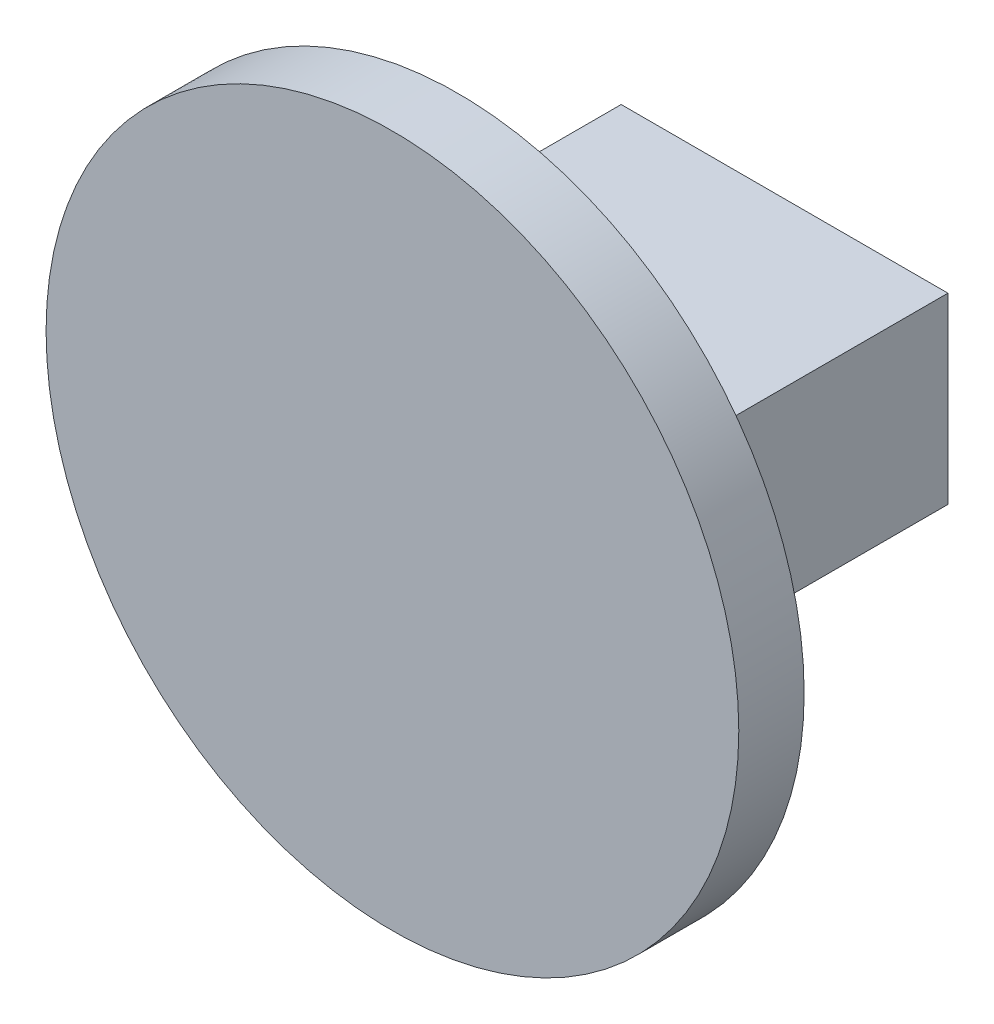
ISO-10303-21;
HEADER;
FILE_DESCRIPTION(('STEP AP214'),'2;1');
FILE_NAME('part.step','',(''),(''),'','','');
FILE_SCHEMA(('AUTOMOTIVE_DESIGN { 1 0 10303 214 1 1 1 1 }'));
ENDSEC;
DATA;
#1=APPLICATION_CONTEXT('core data for automotive mechanical design processes');
#2=APPLICATION_PROTOCOL_DEFINITION('international standard','automotive_design',2000,#1);
#3=PRODUCT_CONTEXT('',#1,'mechanical');
#4=PRODUCT('Part','Part','',(#3));
#5=PRODUCT_RELATED_PRODUCT_CATEGORY('part','',(#4));
#6=PRODUCT_DEFINITION_FORMATION('','',#4);
#7=PRODUCT_DEFINITION_CONTEXT('part definition',#1,'design');
#8=PRODUCT_DEFINITION('design','',#6,#7);
#9=PRODUCT_DEFINITION_SHAPE('','',#8);
#10=(LENGTH_UNIT() NAMED_UNIT(*) SI_UNIT(.MILLI.,.METRE.));
#11=(NAMED_UNIT(*) PLANE_ANGLE_UNIT() SI_UNIT($,.RADIAN.));
#12=(NAMED_UNIT(*) SI_UNIT($,.STERADIAN.) SOLID_ANGLE_UNIT());
#13=UNCERTAINTY_MEASURE_WITH_UNIT(LENGTH_MEASURE(1.E-05),#10,'distance_accuracy_value','');
#14=(GEOMETRIC_REPRESENTATION_CONTEXT(3) GLOBAL_UNCERTAINTY_ASSIGNED_CONTEXT((#13)) GLOBAL_UNIT_ASSIGNED_CONTEXT((#10,
#11,#12)) REPRESENTATION_CONTEXT('',''));
#15=CARTESIAN_POINT('',(0.,0.,0.));
#16=DIRECTION('',(0.,0.,1.));
#17=DIRECTION('',(1.,0.,0.));
#18=AXIS2_PLACEMENT_3D('',#15,#16,#17);
#19=CARTESIAN_POINT('',(0.,0.,254.));
#20=DIRECTION('',(0.,0.,-1.));
#21=DIRECTION('',(-1.,0.,0.));
#22=AXIS2_PLACEMENT_3D('',#19,#20,#21);
#23=CYLINDRICAL_SURFACE('',#22,1346.2);
#24=CARTESIAN_POINT('',(0.,0.,254.));
#25=DIRECTION('',(0.,0.,1.));
#26=DIRECTION('',(1.,0.,0.));
#27=AXIS2_PLACEMENT_3D('',#24,#25,#26);
#28=CIRCLE('',#27,1346.2);
#29=CARTESIAN_POINT('',(1346.2,0.,254.));
#30=VERTEX_POINT('',#29);
#31=EDGE_CURVE('E12',#30,#30,#28,.T.);
#32=ORIENTED_EDGE('',*,*,#31,.F.);
#33=EDGE_LOOP('',(#32));
#34=FACE_BOUND('',#33,.T.);
#35=CARTESIAN_POINT('',(0.,0.,0.));
#36=DIRECTION('',(0.,0.,1.));
#37=DIRECTION('',(1.,0.,0.));
#38=AXIS2_PLACEMENT_3D('',#35,#36,#37);
#39=CIRCLE('',#38,1346.2);
#40=CARTESIAN_POINT('',(1346.2,0.,0.));
#41=VERTEX_POINT('',#40);
#42=EDGE_CURVE('E64',#41,#41,#39,.T.);
#43=ORIENTED_EDGE('',*,*,#42,.T.);
#44=EDGE_LOOP('',(#43));
#45=FACE_BOUND('',#44,.T.);
#46=ADVANCED_FACE('F61',(#34,#45),#23,.T.);
#47=CARTESIAN_POINT('',(0.,0.,254.));
#48=DIRECTION('',(0.,0.,1.));
#49=DIRECTION('',(1.,0.,0.));
#50=AXIS2_PLACEMENT_3D('',#47,#48,#49);
#51=PLANE('',#50);
#52=ORIENTED_EDGE('',*,*,#31,.T.);
#53=EDGE_LOOP('',(#52));
#54=FACE_BOUND('',#53,.T.);
#55=ADVANCED_FACE('F150',(#54),#51,.T.);
#56=CARTESIAN_POINT('',(0.,0.,0.));
#57=DIRECTION('',(0.,0.,1.));
#58=DIRECTION('',(1.,0.,0.));
#59=AXIS2_PLACEMENT_3D('',#56,#57,#58);
#60=PLANE('',#59);
#61=DIRECTION('',(0.,1.,0.));
#62=VECTOR('',#61,1.);
#63=CARTESIAN_POINT('',(-635.,0.,0.));
#64=LINE('',#63,#62);
#65=CARTESIAN_POINT('',(-635.,-355.6,0.));
#66=VERTEX_POINT('',#65);
#67=CARTESIAN_POINT('',(-635.,355.6,0.));
#68=VERTEX_POINT('',#67);
#69=EDGE_CURVE('E120',#66,#68,#64,.T.);
#70=ORIENTED_EDGE('',*,*,#69,.F.);
#71=DIRECTION('',(1.,0.,0.));
#72=VECTOR('',#71,1.);
#73=CARTESIAN_POINT('',(0.,-355.6,0.));
#74=LINE('',#73,#72);
#75=CARTESIAN_POINT('',(635.,-355.6,0.));
#76=VERTEX_POINT('',#75);
#77=EDGE_CURVE('E75',#66,#76,#74,.T.);
#78=ORIENTED_EDGE('',*,*,#77,.T.);
#79=DIRECTION('',(0.,1.,0.));
#80=VECTOR('',#79,1.);
#81=CARTESIAN_POINT('',(635.,0.,0.));
#82=LINE('',#81,#80);
#83=CARTESIAN_POINT('',(635.,355.6,0.));
#84=VERTEX_POINT('',#83);
#85=EDGE_CURVE('E80',#76,#84,#82,.T.);
#86=ORIENTED_EDGE('',*,*,#85,.T.);
#87=DIRECTION('',(1.,0.,0.));
#88=VECTOR('',#87,1.);
#89=CARTESIAN_POINT('',(0.,355.6,0.));
#90=LINE('',#89,#88);
#91=EDGE_CURVE('E123',#68,#84,#90,.T.);
#92=ORIENTED_EDGE('',*,*,#91,.F.);
#93=EDGE_LOOP('',(#70,#78,#86,#92));
#94=FACE_BOUND('',#93,.T.);
#95=ORIENTED_EDGE('',*,*,#42,.F.);
#96=EDGE_LOOP('',(#95));
#97=FACE_BOUND('',#96,.T.);
#98=ADVANCED_FACE('F139',(#94,#97),#60,.F.);
#99=CARTESIAN_POINT('',(-635.,0.,-1270.));
#100=DIRECTION('',(1.,0.,0.));
#101=DIRECTION('',(0.,0.,-1.));
#102=AXIS2_PLACEMENT_3D('',#99,#100,#101);
#103=PLANE('',#102);
#104=ORIENTED_EDGE('',*,*,#69,.T.);
#105=DIRECTION('',(0.,0.,1.));
#106=VECTOR('',#105,1.);
#107=CARTESIAN_POINT('',(-635.,355.6,-1270.));
#108=LINE('',#107,#106);
#109=CARTESIAN_POINT('',(-635.,355.6,-1270.));
#110=VERTEX_POINT('',#109);
#111=EDGE_CURVE('E133',#110,#68,#108,.T.);
#112=ORIENTED_EDGE('',*,*,#111,.F.);
#113=DIRECTION('',(0.,1.,0.));
#114=VECTOR('',#113,1.);
#115=CARTESIAN_POINT('',(-635.,0.,-1270.));
#116=LINE('',#115,#114);
#117=CARTESIAN_POINT('',(-635.,-355.6,-1270.));
#118=VERTEX_POINT('',#117);
#119=EDGE_CURVE('E106',#118,#110,#116,.T.);
#120=ORIENTED_EDGE('',*,*,#119,.F.);
#121=DIRECTION('',(0.,0.,1.));
#122=VECTOR('',#121,1.);
#123=CARTESIAN_POINT('',(-635.,-355.6,-1270.));
#124=LINE('',#123,#122);
#125=EDGE_CURVE('E118',#118,#66,#124,.T.);
#126=ORIENTED_EDGE('',*,*,#125,.T.);
#127=EDGE_LOOP('',(#104,#112,#120,#126));
#128=FACE_BOUND('',#127,.T.);
#129=ADVANCED_FACE('F142',(#128),#103,.F.);
#130=CARTESIAN_POINT('',(0.,-355.6,-1270.));
#131=DIRECTION('',(0.,-1.,0.));
#132=DIRECTION('',(0.,0.,-1.));
#133=AXIS2_PLACEMENT_3D('',#130,#131,#132);
#134=PLANE('',#133);
#135=ORIENTED_EDGE('',*,*,#77,.F.);
#136=ORIENTED_EDGE('',*,*,#125,.F.);
#137=DIRECTION('',(1.,0.,0.));
#138=VECTOR('',#137,1.);
#139=CARTESIAN_POINT('',(0.,-355.6,-1270.));
#140=LINE('',#139,#138);
#141=CARTESIAN_POINT('',(635.,-355.6,-1270.));
#142=VERTEX_POINT('',#141);
#143=EDGE_CURVE('E111',#118,#142,#140,.T.);
#144=ORIENTED_EDGE('',*,*,#143,.T.);
#145=DIRECTION('',(0.,0.,1.));
#146=VECTOR('',#145,1.);
#147=CARTESIAN_POINT('',(635.,-355.6,-1270.));
#148=LINE('',#147,#146);
#149=EDGE_CURVE('E99',#142,#76,#148,.T.);
#150=ORIENTED_EDGE('',*,*,#149,.T.);
#151=EDGE_LOOP('',(#135,#136,#144,#150));
#152=FACE_BOUND('',#151,.T.);
#153=ADVANCED_FACE('F116',(#152),#134,.T.);
#154=CARTESIAN_POINT('',(635.,0.,-1270.));
#155=DIRECTION('',(1.,0.,0.));
#156=DIRECTION('',(0.,0.,-1.));
#157=AXIS2_PLACEMENT_3D('',#154,#155,#156);
#158=PLANE('',#157);
#159=ORIENTED_EDGE('',*,*,#85,.F.);
#160=ORIENTED_EDGE('',*,*,#149,.F.);
#161=DIRECTION('',(0.,1.,0.));
#162=VECTOR('',#161,1.);
#163=CARTESIAN_POINT('',(635.,0.,-1270.));
#164=LINE('',#163,#162);
#165=CARTESIAN_POINT('',(635.,355.6,-1270.));
#166=VERTEX_POINT('',#165);
#167=EDGE_CURVE('E102',#142,#166,#164,.T.);
#168=ORIENTED_EDGE('',*,*,#167,.T.);
#169=DIRECTION('',(0.,0.,1.));
#170=VECTOR('',#169,1.);
#171=CARTESIAN_POINT('',(635.,355.6,-1270.));
#172=LINE('',#171,#170);
#173=EDGE_CURVE('E105',#166,#84,#172,.T.);
#174=ORIENTED_EDGE('',*,*,#173,.T.);
#175=EDGE_LOOP('',(#159,#160,#168,#174));
#176=FACE_BOUND('',#175,.T.);
#177=ADVANCED_FACE('F101',(#176),#158,.T.);
#178=CARTESIAN_POINT('',(0.,355.6,-1270.));
#179=DIRECTION('',(0.,-1.,0.));
#180=DIRECTION('',(0.,0.,-1.));
#181=AXIS2_PLACEMENT_3D('',#178,#179,#180);
#182=PLANE('',#181);
#183=ORIENTED_EDGE('',*,*,#91,.T.);
#184=ORIENTED_EDGE('',*,*,#173,.F.);
#185=DIRECTION('',(1.,0.,0.));
#186=VECTOR('',#185,1.);
#187=CARTESIAN_POINT('',(0.,355.6,-1270.));
#188=LINE('',#187,#186);
#189=EDGE_CURVE('E113',#110,#166,#188,.T.);
#190=ORIENTED_EDGE('',*,*,#189,.F.);
#191=ORIENTED_EDGE('',*,*,#111,.T.);
#192=EDGE_LOOP('',(#183,#184,#190,#191));
#193=FACE_BOUND('',#192,.T.);
#194=ADVANCED_FACE('F137',(#193),#182,.F.);
#195=CARTESIAN_POINT('',(0.,0.,-1270.));
#196=DIRECTION('',(0.,0.,1.));
#197=DIRECTION('',(1.,0.,0.));
#198=AXIS2_PLACEMENT_3D('',#195,#196,#197);
#199=PLANE('',#198);
#200=ORIENTED_EDGE('',*,*,#143,.F.);
#201=ORIENTED_EDGE('',*,*,#119,.T.);
#202=ORIENTED_EDGE('',*,*,#189,.T.);
#203=ORIENTED_EDGE('',*,*,#167,.F.);
#204=EDGE_LOOP('',(#200,#201,#202,#203));
#205=FACE_BOUND('',#204,.T.);
#206=ADVANCED_FACE('F110',(#205),#199,.F.);
#207=CLOSED_SHELL('',(#46,#55,#98,#129,#153,#177,#194,#206));
#208=MANIFOLD_SOLID_BREP('B2',#207);
#209=ADVANCED_BREP_SHAPE_REPRESENTATION('',(#18,#208),#14);
#210=SHAPE_DEFINITION_REPRESENTATION(#9,#209);
ENDSEC;
END-ISO-10303-21;
